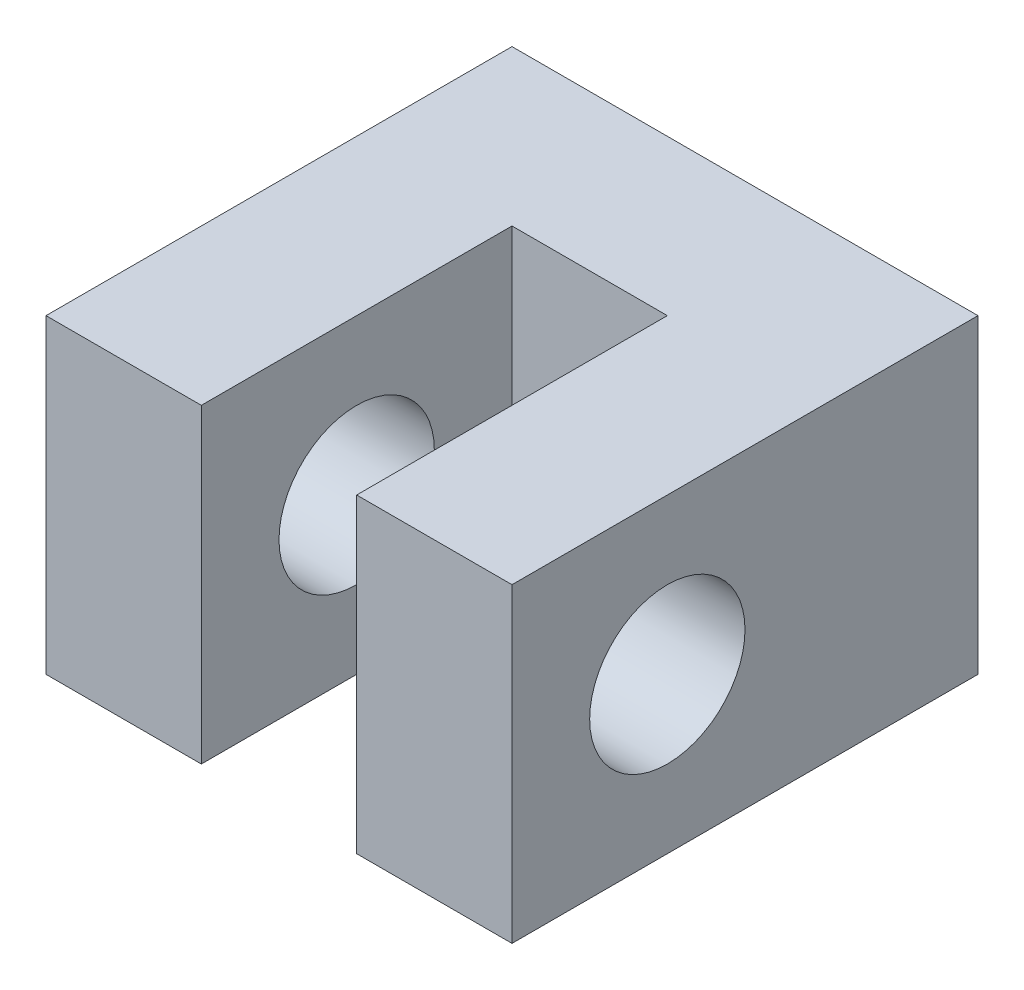
ISO-10303-21;
HEADER;
FILE_DESCRIPTION(('STEP AP214'),'2;1');
FILE_NAME('part.step','',(''),(''),'','','');
FILE_SCHEMA(('AUTOMOTIVE_DESIGN { 1 0 10303 214 1 1 1 1 }'));
ENDSEC;
DATA;
#1=APPLICATION_CONTEXT('core data for automotive mechanical design processes');
#2=APPLICATION_PROTOCOL_DEFINITION('international standard','automotive_design',2000,#1);
#3=PRODUCT_CONTEXT('',#1,'mechanical');
#4=PRODUCT('Part','Part','',(#3));
#5=PRODUCT_RELATED_PRODUCT_CATEGORY('part','',(#4));
#6=PRODUCT_DEFINITION_FORMATION('','',#4);
#7=PRODUCT_DEFINITION_CONTEXT('part definition',#1,'design');
#8=PRODUCT_DEFINITION('design','',#6,#7);
#9=PRODUCT_DEFINITION_SHAPE('','',#8);
#10=(LENGTH_UNIT() NAMED_UNIT(*) SI_UNIT(.MILLI.,.METRE.));
#11=(NAMED_UNIT(*) PLANE_ANGLE_UNIT() SI_UNIT($,.RADIAN.));
#12=(NAMED_UNIT(*) SI_UNIT($,.STERADIAN.) SOLID_ANGLE_UNIT());
#13=UNCERTAINTY_MEASURE_WITH_UNIT(LENGTH_MEASURE(1.E-05),#10,'distance_accuracy_value','');
#14=(GEOMETRIC_REPRESENTATION_CONTEXT(3) GLOBAL_UNCERTAINTY_ASSIGNED_CONTEXT((#13)) GLOBAL_UNIT_ASSIGNED_CONTEXT((#10,
#11,#12)) REPRESENTATION_CONTEXT('',''));
#15=CARTESIAN_POINT('',(0.,0.,0.));
#16=DIRECTION('',(0.,0.,1.));
#17=DIRECTION('',(1.,0.,0.));
#18=AXIS2_PLACEMENT_3D('',#15,#16,#17);
#19=CARTESIAN_POINT('',(-9.525,-6.35,19.05));
#20=DIRECTION('',(-1.,0.,0.));
#21=DIRECTION('',(0.,0.,1.));
#22=AXIS2_PLACEMENT_3D('',#19,#20,#21);
#23=PLANE('',#22);
#24=CARTESIAN_POINT('',(-9.525,0.,12.7));
#25=DIRECTION('',(-1.,0.,0.));
#26=DIRECTION('',(0.,0.,1.));
#27=AXIS2_PLACEMENT_3D('',#24,#25,#26);
#28=CIRCLE('',#27,3.175);
#29=CARTESIAN_POINT('',(-9.525,0.,15.875));
#30=VERTEX_POINT('',#29);
#31=EDGE_CURVE('E220',#30,#30,#28,.T.);
#32=ORIENTED_EDGE('',*,*,#31,.F.);
#33=EDGE_LOOP('',(#32));
#34=FACE_BOUND('',#33,.T.);
#35=DIRECTION('',(0.,0.,1.));
#36=VECTOR('',#35,1.);
#37=CARTESIAN_POINT('',(-9.525,6.35,19.05));
#38=LINE('',#37,#36);
#39=CARTESIAN_POINT('',(-9.525,6.35,0.));
#40=VERTEX_POINT('',#39);
#41=CARTESIAN_POINT('',(-9.525,6.35,19.05));
#42=VERTEX_POINT('',#41);
#43=EDGE_CURVE('E131',#40,#42,#38,.T.);
#44=ORIENTED_EDGE('',*,*,#43,.F.);
#45=DIRECTION('',(0.,1.,0.));
#46=VECTOR('',#45,1.);
#47=CARTESIAN_POINT('',(-9.525,-6.35,0.));
#48=LINE('',#47,#46);
#49=CARTESIAN_POINT('',(-9.525,-6.35,0.));
#50=VERTEX_POINT('',#49);
#51=EDGE_CURVE('E11',#50,#40,#48,.T.);
#52=ORIENTED_EDGE('',*,*,#51,.F.);
#53=DIRECTION('',(0.,0.,1.));
#54=VECTOR('',#53,1.);
#55=CARTESIAN_POINT('',(-9.525,-6.35,19.05));
#56=LINE('',#55,#54);
#57=CARTESIAN_POINT('',(-9.525,-6.35,19.05));
#58=VERTEX_POINT('',#57);
#59=EDGE_CURVE('E152',#50,#58,#56,.T.);
#60=ORIENTED_EDGE('',*,*,#59,.T.);
#61=DIRECTION('',(0.,1.,0.));
#62=VECTOR('',#61,1.);
#63=CARTESIAN_POINT('',(-9.525,-6.35,19.05));
#64=LINE('',#63,#62);
#65=EDGE_CURVE('E89',#58,#42,#64,.T.);
#66=ORIENTED_EDGE('',*,*,#65,.T.);
#67=EDGE_LOOP('',(#44,#52,#60,#66));
#68=FACE_BOUND('',#67,.T.);
#69=ADVANCED_FACE('F33',(#34,#68),#23,.T.);
#70=CARTESIAN_POINT('',(-9.525,-6.35,0.));
#71=DIRECTION('',(0.,0.,-1.));
#72=DIRECTION('',(-1.,0.,0.));
#73=AXIS2_PLACEMENT_3D('',#70,#71,#72);
#74=PLANE('',#73);
#75=CARTESIAN_POINT('',(0.,0.,0.));
#76=DIRECTION('',(0.,0.,1.));
#77=DIRECTION('',(1.,0.,0.));
#78=AXIS2_PLACEMENT_3D('',#75,#76,#77);
#79=CIRCLE('',#78,3.175);
#80=CARTESIAN_POINT('',(3.175,0.,0.));
#81=VERTEX_POINT('',#80);
#82=EDGE_CURVE('E221',#81,#81,#79,.T.);
#83=ORIENTED_EDGE('',*,*,#82,.T.);
#84=EDGE_LOOP('',(#83));
#85=FACE_BOUND('',#84,.T.);
#86=DIRECTION('',(-1.,0.,0.));
#87=VECTOR('',#86,1.);
#88=CARTESIAN_POINT('',(-9.525,6.35,0.));
#89=LINE('',#88,#87);
#90=CARTESIAN_POINT('',(9.525,6.35,0.));
#91=VERTEX_POINT('',#90);
#92=EDGE_CURVE('E150',#91,#40,#89,.T.);
#93=ORIENTED_EDGE('',*,*,#92,.F.);
#94=DIRECTION('',(0.,1.,0.));
#95=VECTOR('',#94,1.);
#96=CARTESIAN_POINT('',(9.525,-6.35,0.));
#97=LINE('',#96,#95);
#98=CARTESIAN_POINT('',(9.525,-6.35,0.));
#99=VERTEX_POINT('',#98);
#100=EDGE_CURVE('E42',#99,#91,#97,.T.);
#101=ORIENTED_EDGE('',*,*,#100,.F.);
#102=DIRECTION('',(-1.,0.,0.));
#103=VECTOR('',#102,1.);
#104=CARTESIAN_POINT('',(-9.525,-6.35,0.));
#105=LINE('',#104,#103);
#106=EDGE_CURVE('E121',#99,#50,#105,.T.);
#107=ORIENTED_EDGE('',*,*,#106,.T.);
#108=ORIENTED_EDGE('',*,*,#51,.T.);
#109=EDGE_LOOP('',(#93,#101,#107,#108));
#110=FACE_BOUND('',#109,.T.);
#111=ADVANCED_FACE('F165',(#85,#110),#74,.T.);
#112=CARTESIAN_POINT('',(9.525,-6.35,0.));
#113=DIRECTION('',(1.,0.,0.));
#114=DIRECTION('',(0.,0.,-1.));
#115=AXIS2_PLACEMENT_3D('',#112,#113,#114);
#116=PLANE('',#115);
#117=CARTESIAN_POINT('',(9.525,0.,12.7));
#118=DIRECTION('',(-1.,0.,0.));
#119=DIRECTION('',(0.,0.,1.));
#120=AXIS2_PLACEMENT_3D('',#117,#118,#119);
#121=CIRCLE('',#120,3.175);
#122=CARTESIAN_POINT('',(9.525,0.,15.875));
#123=VERTEX_POINT('',#122);
#124=EDGE_CURVE('E224',#123,#123,#121,.T.);
#125=ORIENTED_EDGE('',*,*,#124,.T.);
#126=EDGE_LOOP('',(#125));
#127=FACE_BOUND('',#126,.T.);
#128=DIRECTION('',(0.,0.,-1.));
#129=VECTOR('',#128,1.);
#130=CARTESIAN_POINT('',(9.525,6.35,0.));
#131=LINE('',#130,#129);
#132=CARTESIAN_POINT('',(9.525,6.35,19.05));
#133=VERTEX_POINT('',#132);
#134=EDGE_CURVE('E108',#133,#91,#131,.T.);
#135=ORIENTED_EDGE('',*,*,#134,.F.);
#136=DIRECTION('',(0.,1.,0.));
#137=VECTOR('',#136,1.);
#138=CARTESIAN_POINT('',(9.525,-6.35,19.05));
#139=LINE('',#138,#137);
#140=CARTESIAN_POINT('',(9.525,-6.35,19.05));
#141=VERTEX_POINT('',#140);
#142=EDGE_CURVE('E103',#141,#133,#139,.T.);
#143=ORIENTED_EDGE('',*,*,#142,.F.);
#144=DIRECTION('',(0.,0.,-1.));
#145=VECTOR('',#144,1.);
#146=CARTESIAN_POINT('',(9.525,-6.35,0.));
#147=LINE('',#146,#145);
#148=EDGE_CURVE('E106',#141,#99,#147,.T.);
#149=ORIENTED_EDGE('',*,*,#148,.T.);
#150=ORIENTED_EDGE('',*,*,#100,.T.);
#151=EDGE_LOOP('',(#135,#143,#149,#150));
#152=FACE_BOUND('',#151,.T.);
#153=ADVANCED_FACE('F105',(#127,#152),#116,.T.);
#154=CARTESIAN_POINT('',(9.525,-6.35,19.05));
#155=DIRECTION('',(0.,0.,1.));
#156=DIRECTION('',(1.,0.,0.));
#157=AXIS2_PLACEMENT_3D('',#154,#155,#156);
#158=PLANE('',#157);
#159=DIRECTION('',(1.,0.,0.));
#160=VECTOR('',#159,1.);
#161=CARTESIAN_POINT('',(9.525,6.35,19.05));
#162=LINE('',#161,#160);
#163=CARTESIAN_POINT('',(3.175,6.35,19.05));
#164=VERTEX_POINT('',#163);
#165=EDGE_CURVE('E147',#164,#133,#162,.T.);
#166=ORIENTED_EDGE('',*,*,#165,.F.);
#167=DIRECTION('',(0.,1.,0.));
#168=VECTOR('',#167,1.);
#169=CARTESIAN_POINT('',(3.175,-6.35,19.05));
#170=LINE('',#169,#168);
#171=CARTESIAN_POINT('',(3.175,-6.35,19.05));
#172=VERTEX_POINT('',#171);
#173=EDGE_CURVE('E113',#172,#164,#170,.T.);
#174=ORIENTED_EDGE('',*,*,#173,.F.);
#175=DIRECTION('',(1.,0.,0.));
#176=VECTOR('',#175,1.);
#177=CARTESIAN_POINT('',(9.525,-6.35,19.05));
#178=LINE('',#177,#176);
#179=EDGE_CURVE('E119',#172,#141,#178,.T.);
#180=ORIENTED_EDGE('',*,*,#179,.T.);
#181=ORIENTED_EDGE('',*,*,#142,.T.);
#182=EDGE_LOOP('',(#166,#174,#180,#181));
#183=FACE_BOUND('',#182,.T.);
#184=ADVANCED_FACE('F123',(#183),#158,.T.);
#185=CARTESIAN_POINT('',(3.175,-6.35,19.05));
#186=DIRECTION('',(-1.,0.,0.));
#187=DIRECTION('',(0.,0.,1.));
#188=AXIS2_PLACEMENT_3D('',#185,#186,#187);
#189=PLANE('',#188);
#190=CARTESIAN_POINT('',(3.175,0.,12.7));
#191=DIRECTION('',(-1.,0.,0.));
#192=DIRECTION('',(0.,0.,1.));
#193=AXIS2_PLACEMENT_3D('',#190,#191,#192);
#194=CIRCLE('',#193,3.175);
#195=CARTESIAN_POINT('',(3.175,0.,15.875));
#196=VERTEX_POINT('',#195);
#197=EDGE_CURVE('E135',#196,#196,#194,.T.);
#198=ORIENTED_EDGE('',*,*,#197,.F.);
#199=EDGE_LOOP('',(#198));
#200=FACE_BOUND('',#199,.T.);
#201=DIRECTION('',(0.,0.,1.));
#202=VECTOR('',#201,1.);
#203=CARTESIAN_POINT('',(3.175,6.35,19.05));
#204=LINE('',#203,#202);
#205=CARTESIAN_POINT('',(3.175,6.35,6.34999999999999));
#206=VERTEX_POINT('',#205);
#207=EDGE_CURVE('E144',#206,#164,#204,.T.);
#208=ORIENTED_EDGE('',*,*,#207,.F.);
#209=DIRECTION('',(0.,1.,0.));
#210=VECTOR('',#209,1.);
#211=CARTESIAN_POINT('',(3.175,-6.35,6.34999999999999));
#212=LINE('',#211,#210);
#213=CARTESIAN_POINT('',(3.175,-6.35,6.34999999999999));
#214=VERTEX_POINT('',#213);
#215=EDGE_CURVE('E156',#214,#206,#212,.T.);
#216=ORIENTED_EDGE('',*,*,#215,.F.);
#217=DIRECTION('',(0.,0.,1.));
#218=VECTOR('',#217,1.);
#219=CARTESIAN_POINT('',(3.175,-6.35,19.05));
#220=LINE('',#219,#218);
#221=EDGE_CURVE('E124',#214,#172,#220,.T.);
#222=ORIENTED_EDGE('',*,*,#221,.T.);
#223=ORIENTED_EDGE('',*,*,#173,.T.);
#224=EDGE_LOOP('',(#208,#216,#222,#223));
#225=FACE_BOUND('',#224,.T.);
#226=ADVANCED_FACE('F184',(#200,#225),#189,.T.);
#227=CARTESIAN_POINT('',(3.175,-6.35,6.34999999999999));
#228=DIRECTION('',(0.,0.,1.));
#229=DIRECTION('',(1.,0.,0.));
#230=AXIS2_PLACEMENT_3D('',#227,#228,#229);
#231=PLANE('',#230);
#232=DIRECTION('',(1.,0.,0.));
#233=VECTOR('',#232,1.);
#234=CARTESIAN_POINT('',(3.175,6.35,6.34999999999999));
#235=LINE('',#234,#233);
#236=CARTESIAN_POINT('',(-3.175,6.35,6.34999999999999));
#237=VERTEX_POINT('',#236);
#238=EDGE_CURVE('E141',#237,#206,#235,.T.);
#239=ORIENTED_EDGE('',*,*,#238,.F.);
#240=DIRECTION('',(0.,1.,0.));
#241=VECTOR('',#240,1.);
#242=CARTESIAN_POINT('',(-3.175,-6.35,6.34999999999999));
#243=LINE('',#242,#241);
#244=CARTESIAN_POINT('',(-3.175,-6.35,6.34999999999999));
#245=VERTEX_POINT('',#244);
#246=EDGE_CURVE('E158',#245,#237,#243,.T.);
#247=ORIENTED_EDGE('',*,*,#246,.F.);
#248=DIRECTION('',(1.,0.,0.));
#249=VECTOR('',#248,1.);
#250=CARTESIAN_POINT('',(3.175,-6.35,6.34999999999999));
#251=LINE('',#250,#249);
#252=EDGE_CURVE('E126',#245,#214,#251,.T.);
#253=ORIENTED_EDGE('',*,*,#252,.T.);
#254=ORIENTED_EDGE('',*,*,#215,.T.);
#255=EDGE_LOOP('',(#239,#247,#253,#254));
#256=FACE_BOUND('',#255,.T.);
#257=ADVANCED_FACE('F187',(#256),#231,.T.);
#258=CARTESIAN_POINT('',(-3.175,-6.35,6.34999999999999));
#259=DIRECTION('',(1.,0.,0.));
#260=DIRECTION('',(0.,0.,-1.));
#261=AXIS2_PLACEMENT_3D('',#258,#259,#260);
#262=PLANE('',#261);
#263=CARTESIAN_POINT('',(-3.175,0.,12.7));
#264=DIRECTION('',(1.,0.,0.));
#265=DIRECTION('',(0.,0.,-1.));
#266=AXIS2_PLACEMENT_3D('',#263,#264,#265);
#267=CIRCLE('',#266,3.175);
#268=CARTESIAN_POINT('',(-3.175,0.,9.52500000000002));
#269=VERTEX_POINT('',#268);
#270=EDGE_CURVE('E36',#269,#269,#267,.T.);
#271=ORIENTED_EDGE('',*,*,#270,.F.);
#272=EDGE_LOOP('',(#271));
#273=FACE_BOUND('',#272,.T.);
#274=DIRECTION('',(0.,0.,-1.));
#275=VECTOR('',#274,1.);
#276=CARTESIAN_POINT('',(-3.175,6.35,6.34999999999999));
#277=LINE('',#276,#275);
#278=CARTESIAN_POINT('',(-3.17499999999999,6.35,19.05));
#279=VERTEX_POINT('',#278);
#280=EDGE_CURVE('E138',#279,#237,#277,.T.);
#281=ORIENTED_EDGE('',*,*,#280,.F.);
#282=DIRECTION('',(0.,1.,0.));
#283=VECTOR('',#282,1.);
#284=CARTESIAN_POINT('',(-3.17499999999999,-6.35,19.05));
#285=LINE('',#284,#283);
#286=CARTESIAN_POINT('',(-3.17499999999999,-6.35,19.05));
#287=VERTEX_POINT('',#286);
#288=EDGE_CURVE('E160',#287,#279,#285,.T.);
#289=ORIENTED_EDGE('',*,*,#288,.F.);
#290=DIRECTION('',(0.,0.,-1.));
#291=VECTOR('',#290,1.);
#292=CARTESIAN_POINT('',(-3.175,-6.35,6.34999999999999));
#293=LINE('',#292,#291);
#294=EDGE_CURVE('E235',#287,#245,#293,.T.);
#295=ORIENTED_EDGE('',*,*,#294,.T.);
#296=ORIENTED_EDGE('',*,*,#246,.T.);
#297=EDGE_LOOP('',(#281,#289,#295,#296));
#298=FACE_BOUND('',#297,.T.);
#299=ADVANCED_FACE('F191',(#273,#298),#262,.T.);
#300=CARTESIAN_POINT('',(-3.17499999999999,-6.35,19.05));
#301=DIRECTION('',(0.,0.,1.));
#302=DIRECTION('',(1.,0.,0.));
#303=AXIS2_PLACEMENT_3D('',#300,#301,#302);
#304=PLANE('',#303);
#305=DIRECTION('',(1.,0.,0.));
#306=VECTOR('',#305,1.);
#307=CARTESIAN_POINT('',(-3.17499999999999,6.35,19.05));
#308=LINE('',#307,#306);
#309=EDGE_CURVE('E134',#42,#279,#308,.T.);
#310=ORIENTED_EDGE('',*,*,#309,.F.);
#311=ORIENTED_EDGE('',*,*,#65,.F.);
#312=DIRECTION('',(1.,0.,0.));
#313=VECTOR('',#312,1.);
#314=CARTESIAN_POINT('',(-3.17499999999999,-6.35,19.05));
#315=LINE('',#314,#313);
#316=EDGE_CURVE('E233',#58,#287,#315,.T.);
#317=ORIENTED_EDGE('',*,*,#316,.T.);
#318=ORIENTED_EDGE('',*,*,#288,.T.);
#319=EDGE_LOOP('',(#310,#311,#317,#318));
#320=FACE_BOUND('',#319,.T.);
#321=ADVANCED_FACE('F161',(#320),#304,.T.);
#322=CARTESIAN_POINT('',(0.,-6.35,0.));
#323=DIRECTION('',(0.,-1.,0.));
#324=DIRECTION('',(0.,0.,-1.));
#325=AXIS2_PLACEMENT_3D('',#322,#323,#324);
#326=PLANE('',#325);
#327=ORIENTED_EDGE('',*,*,#59,.F.);
#328=ORIENTED_EDGE('',*,*,#106,.F.);
#329=ORIENTED_EDGE('',*,*,#148,.F.);
#330=ORIENTED_EDGE('',*,*,#179,.F.);
#331=ORIENTED_EDGE('',*,*,#221,.F.);
#332=ORIENTED_EDGE('',*,*,#252,.F.);
#333=ORIENTED_EDGE('',*,*,#294,.F.);
#334=ORIENTED_EDGE('',*,*,#316,.F.);
#335=EDGE_LOOP('',(#327,#328,#329,#330,#331,#332,#333,#334));
#336=FACE_BOUND('',#335,.T.);
#337=ADVANCED_FACE('F117',(#336),#326,.T.);
#338=CARTESIAN_POINT('',(0.,6.35,0.));
#339=DIRECTION('',(0.,-1.,0.));
#340=DIRECTION('',(0.,0.,-1.));
#341=AXIS2_PLACEMENT_3D('',#338,#339,#340);
#342=PLANE('',#341);
#343=ORIENTED_EDGE('',*,*,#43,.T.);
#344=ORIENTED_EDGE('',*,*,#309,.T.);
#345=ORIENTED_EDGE('',*,*,#280,.T.);
#346=ORIENTED_EDGE('',*,*,#238,.T.);
#347=ORIENTED_EDGE('',*,*,#207,.T.);
#348=ORIENTED_EDGE('',*,*,#165,.T.);
#349=ORIENTED_EDGE('',*,*,#134,.T.);
#350=ORIENTED_EDGE('',*,*,#92,.T.);
#351=EDGE_LOOP('',(#343,#344,#345,#346,#347,#348,#349,#350));
#352=FACE_BOUND('',#351,.T.);
#353=ADVANCED_FACE('F164',(#352),#342,.F.);
#354=CARTESIAN_POINT('',(9.525,0.,12.7));
#355=DIRECTION('',(-1.,0.,0.));
#356=DIRECTION('',(0.,0.,1.));
#357=AXIS2_PLACEMENT_3D('',#354,#355,#356);
#358=CYLINDRICAL_SURFACE('',#357,3.175);
#359=ORIENTED_EDGE('',*,*,#270,.T.);
#360=EDGE_LOOP('',(#359));
#361=FACE_BOUND('',#360,.T.);
#362=ORIENTED_EDGE('',*,*,#31,.T.);
#363=EDGE_LOOP('',(#362));
#364=FACE_BOUND('',#363,.T.);
#365=ADVANCED_FACE('F202',(#361,#364),#358,.F.);
#366=ORIENTED_EDGE('',*,*,#197,.T.);
#367=EDGE_LOOP('',(#366));
#368=FACE_BOUND('',#367,.T.);
#369=ORIENTED_EDGE('',*,*,#124,.F.);
#370=EDGE_LOOP('',(#369));
#371=FACE_BOUND('',#370,.T.);
#372=ADVANCED_FACE('F206',(#368,#371),#358,.F.);
#373=CARTESIAN_POINT('',(0.,0.,2.54));
#374=DIRECTION('',(0.,0.,-1.));
#375=DIRECTION('',(-1.,0.,0.));
#376=AXIS2_PLACEMENT_3D('',#373,#374,#375);
#377=CYLINDRICAL_SURFACE('',#376,3.175);
#378=CARTESIAN_POINT('',(0.,0.,2.54));
#379=DIRECTION('',(0.,0.,1.));
#380=DIRECTION('',(1.,0.,0.));
#381=AXIS2_PLACEMENT_3D('',#378,#379,#380);
#382=CIRCLE('',#381,3.175);
#383=CARTESIAN_POINT('',(3.175,0.,2.54));
#384=VERTEX_POINT('',#383);
#385=EDGE_CURVE('E219',#384,#384,#382,.T.);
#386=ORIENTED_EDGE('',*,*,#385,.T.);
#387=EDGE_LOOP('',(#386));
#388=FACE_BOUND('',#387,.T.);
#389=ORIENTED_EDGE('',*,*,#82,.F.);
#390=EDGE_LOOP('',(#389));
#391=FACE_BOUND('',#390,.T.);
#392=ADVANCED_FACE('F208',(#388,#391),#377,.F.);
#393=CARTESIAN_POINT('',(0.,0.,2.54));
#394=DIRECTION('',(0.,0.,1.));
#395=DIRECTION('',(1.,0.,0.));
#396=AXIS2_PLACEMENT_3D('',#393,#394,#395);
#397=PLANE('',#396);
#398=ORIENTED_EDGE('',*,*,#385,.F.);
#399=EDGE_LOOP('',(#398));
#400=FACE_BOUND('',#399,.T.);
#401=ADVANCED_FACE('F211',(#400),#397,.F.);
#402=CLOSED_SHELL('',(#69,#111,#153,#184,#226,#257,#299,#321,#337,#353,#365,#372,#392,#401));
#403=MANIFOLD_SOLID_BREP('B2',#402);
#404=ADVANCED_BREP_SHAPE_REPRESENTATION('',(#18,#403),#14);
#405=SHAPE_DEFINITION_REPRESENTATION(#9,#404);
ENDSEC;
END-ISO-10303-21;
